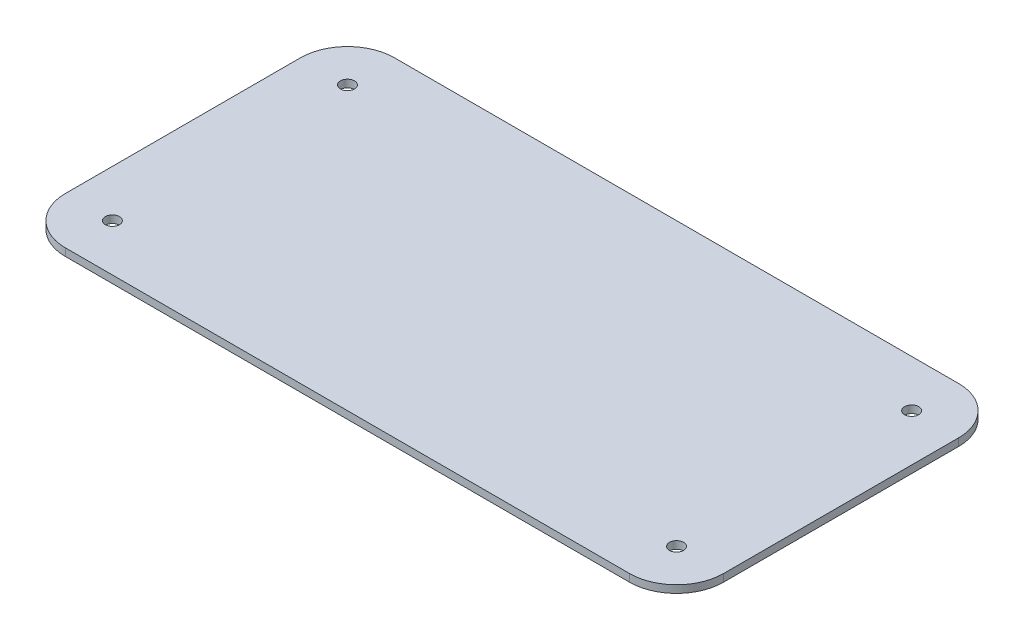
ISO-10303-21;
HEADER;
FILE_DESCRIPTION(('STEP AP214'),'2;1');
FILE_NAME('part.step','',(''),(''),'','','');
FILE_SCHEMA(('AUTOMOTIVE_DESIGN { 1 0 10303 214 1 1 1 1 }'));
ENDSEC;
DATA;
#1=APPLICATION_CONTEXT('core data for automotive mechanical design processes');
#2=APPLICATION_PROTOCOL_DEFINITION('international standard','automotive_design',2000,#1);
#3=PRODUCT_CONTEXT('',#1,'mechanical');
#4=PRODUCT('Part','Part','',(#3));
#5=PRODUCT_RELATED_PRODUCT_CATEGORY('part','',(#4));
#6=PRODUCT_DEFINITION_FORMATION('','',#4);
#7=PRODUCT_DEFINITION_CONTEXT('part definition',#1,'design');
#8=PRODUCT_DEFINITION('design','',#6,#7);
#9=PRODUCT_DEFINITION_SHAPE('','',#8);
#10=(LENGTH_UNIT() NAMED_UNIT(*) SI_UNIT(.MILLI.,.METRE.));
#11=(NAMED_UNIT(*) PLANE_ANGLE_UNIT() SI_UNIT($,.RADIAN.));
#12=(NAMED_UNIT(*) SI_UNIT($,.STERADIAN.) SOLID_ANGLE_UNIT());
#13=UNCERTAINTY_MEASURE_WITH_UNIT(LENGTH_MEASURE(1.E-05),#10,'distance_accuracy_value','');
#14=(GEOMETRIC_REPRESENTATION_CONTEXT(3) GLOBAL_UNCERTAINTY_ASSIGNED_CONTEXT((#13)) GLOBAL_UNIT_ASSIGNED_CONTEXT((#10,
#11,#12)) REPRESENTATION_CONTEXT('',''));
#15=CARTESIAN_POINT('',(0.,0.,0.));
#16=DIRECTION('',(0.,0.,1.));
#17=DIRECTION('',(1.,0.,0.));
#18=AXIS2_PLACEMENT_3D('',#15,#16,#17);
#19=CARTESIAN_POINT('',(50.,8.,-50.));
#20=DIRECTION('',(0.,-1.,0.));
#21=DIRECTION('',(0.,0.,-1.));
#22=AXIS2_PLACEMENT_3D('',#19,#20,#21);
#23=CYLINDRICAL_SURFACE('',#22,50.);
#24=CARTESIAN_POINT('',(50.,0.,-50.));
#25=DIRECTION('',(0.,1.,0.));
#26=DIRECTION('',(0.,0.,1.));
#27=AXIS2_PLACEMENT_3D('',#24,#25,#26);
#28=CIRCLE('',#27,50.);
#29=CARTESIAN_POINT('',(0.,0.,-50.0000000000004));
#30=VERTEX_POINT('',#29);
#31=CARTESIAN_POINT('',(50.0000000000004,0.,0.));
#32=VERTEX_POINT('',#31);
#33=EDGE_CURVE('E101',#30,#32,#28,.T.);
#34=ORIENTED_EDGE('',*,*,#33,.T.);
#35=DIRECTION('',(0.,-1.,0.));
#36=VECTOR('',#35,1.);
#37=CARTESIAN_POINT('',(50.0000000000004,8.,0.));
#38=LINE('',#37,#36);
#39=CARTESIAN_POINT('',(50.0000000000004,8.,0.));
#40=VERTEX_POINT('',#39);
#41=EDGE_CURVE('E11',#40,#32,#38,.T.);
#42=ORIENTED_EDGE('',*,*,#41,.F.);
#43=CARTESIAN_POINT('',(50.,8.,-50.));
#44=DIRECTION('',(0.,1.,0.));
#45=DIRECTION('',(0.,0.,1.));
#46=AXIS2_PLACEMENT_3D('',#43,#44,#45);
#47=CIRCLE('',#46,50.);
#48=CARTESIAN_POINT('',(0.,8.,-50.0000000000004));
#49=VERTEX_POINT('',#48);
#50=EDGE_CURVE('E133',#49,#40,#47,.T.);
#51=ORIENTED_EDGE('',*,*,#50,.F.);
#52=DIRECTION('',(0.,-1.,0.));
#53=VECTOR('',#52,1.);
#54=CARTESIAN_POINT('',(0.,8.,-50.0000000000004));
#55=LINE('',#54,#53);
#56=EDGE_CURVE('E114',#49,#30,#55,.T.);
#57=ORIENTED_EDGE('',*,*,#56,.T.);
#58=EDGE_LOOP('',(#34,#42,#51,#57));
#59=FACE_BOUND('',#58,.T.);
#60=ADVANCED_FACE('F33',(#59),#23,.T.);
#61=CARTESIAN_POINT('',(50.0000000000004,8.,0.));
#62=DIRECTION('',(0.,0.,-1.));
#63=DIRECTION('',(-1.,0.,0.));
#64=AXIS2_PLACEMENT_3D('',#61,#62,#63);
#65=PLANE('',#64);
#66=DIRECTION('',(1.,0.,0.));
#67=VECTOR('',#66,1.);
#68=CARTESIAN_POINT('',(50.0000000000004,0.,0.));
#69=LINE('',#68,#67);
#70=CARTESIAN_POINT('',(650.,0.,0.));
#71=VERTEX_POINT('',#70);
#72=EDGE_CURVE('E97',#32,#71,#69,.T.);
#73=ORIENTED_EDGE('',*,*,#72,.T.);
#74=DIRECTION('',(0.,-1.,0.));
#75=VECTOR('',#74,1.);
#76=CARTESIAN_POINT('',(650.,8.,0.));
#77=LINE('',#76,#75);
#78=CARTESIAN_POINT('',(650.,8.,0.));
#79=VERTEX_POINT('',#78);
#80=EDGE_CURVE('E40',#79,#71,#77,.T.);
#81=ORIENTED_EDGE('',*,*,#80,.F.);
#82=DIRECTION('',(1.,0.,0.));
#83=VECTOR('',#82,1.);
#84=CARTESIAN_POINT('',(50.0000000000004,8.,0.));
#85=LINE('',#84,#83);
#86=EDGE_CURVE('E110',#40,#79,#85,.T.);
#87=ORIENTED_EDGE('',*,*,#86,.F.);
#88=ORIENTED_EDGE('',*,*,#41,.T.);
#89=EDGE_LOOP('',(#73,#81,#87,#88));
#90=FACE_BOUND('',#89,.T.);
#91=ADVANCED_FACE('F109',(#90),#65,.F.);
#92=CARTESIAN_POINT('',(650.,8.,-50.));
#93=DIRECTION('',(0.,-1.,0.));
#94=DIRECTION('',(0.,0.,-1.));
#95=AXIS2_PLACEMENT_3D('',#92,#93,#94);
#96=CYLINDRICAL_SURFACE('',#95,50.);
#97=CARTESIAN_POINT('',(650.,0.,-50.));
#98=DIRECTION('',(0.,1.,0.));
#99=DIRECTION('',(0.,0.,1.));
#100=AXIS2_PLACEMENT_3D('',#97,#98,#99);
#101=CIRCLE('',#100,50.);
#102=CARTESIAN_POINT('',(700.,0.,-50.0000000000004));
#103=VERTEX_POINT('',#102);
#104=EDGE_CURVE('E103',#71,#103,#101,.T.);
#105=ORIENTED_EDGE('',*,*,#104,.T.);
#106=DIRECTION('',(0.,-1.,0.));
#107=VECTOR('',#106,1.);
#108=CARTESIAN_POINT('',(700.,8.,-50.0000000000004));
#109=LINE('',#108,#107);
#110=CARTESIAN_POINT('',(700.,8.,-50.0000000000004));
#111=VERTEX_POINT('',#110);
#112=EDGE_CURVE('E159',#111,#103,#109,.T.);
#113=ORIENTED_EDGE('',*,*,#112,.F.);
#114=CARTESIAN_POINT('',(650.,8.,-50.));
#115=DIRECTION('',(0.,1.,0.));
#116=DIRECTION('',(0.,0.,1.));
#117=AXIS2_PLACEMENT_3D('',#114,#115,#116);
#118=CIRCLE('',#117,50.);
#119=EDGE_CURVE('E136',#79,#111,#118,.T.);
#120=ORIENTED_EDGE('',*,*,#119,.F.);
#121=ORIENTED_EDGE('',*,*,#80,.T.);
#122=EDGE_LOOP('',(#105,#113,#120,#121));
#123=FACE_BOUND('',#122,.T.);
#124=ADVANCED_FACE('F163',(#123),#96,.T.);
#125=CARTESIAN_POINT('',(700.,8.,-50.0000000000004));
#126=DIRECTION('',(-1.,0.,0.));
#127=DIRECTION('',(0.,0.,1.));
#128=AXIS2_PLACEMENT_3D('',#125,#126,#127);
#129=PLANE('',#128);
#130=DIRECTION('',(0.,0.,-1.));
#131=VECTOR('',#130,1.);
#132=CARTESIAN_POINT('',(700.,0.,-50.0000000000004));
#133=LINE('',#132,#131);
#134=CARTESIAN_POINT('',(700.,0.,-300.));
#135=VERTEX_POINT('',#134);
#136=EDGE_CURVE('E123',#103,#135,#133,.T.);
#137=ORIENTED_EDGE('',*,*,#136,.T.);
#138=DIRECTION('',(0.,-1.,0.));
#139=VECTOR('',#138,1.);
#140=CARTESIAN_POINT('',(700.,8.,-300.));
#141=LINE('',#140,#139);
#142=CARTESIAN_POINT('',(700.,8.,-300.));
#143=VERTEX_POINT('',#142);
#144=EDGE_CURVE('E156',#143,#135,#141,.T.);
#145=ORIENTED_EDGE('',*,*,#144,.F.);
#146=DIRECTION('',(0.,0.,-1.));
#147=VECTOR('',#146,1.);
#148=CARTESIAN_POINT('',(700.,8.,-50.0000000000004));
#149=LINE('',#148,#147);
#150=EDGE_CURVE('E138',#111,#143,#149,.T.);
#151=ORIENTED_EDGE('',*,*,#150,.F.);
#152=ORIENTED_EDGE('',*,*,#112,.T.);
#153=EDGE_LOOP('',(#137,#145,#151,#152));
#154=FACE_BOUND('',#153,.T.);
#155=ADVANCED_FACE('F171',(#154),#129,.F.);
#156=CARTESIAN_POINT('',(650.,8.,-300.));
#157=DIRECTION('',(0.,-1.,0.));
#158=DIRECTION('',(0.,0.,-1.));
#159=AXIS2_PLACEMENT_3D('',#156,#157,#158);
#160=CYLINDRICAL_SURFACE('',#159,50.);
#161=CARTESIAN_POINT('',(650.,0.,-300.));
#162=DIRECTION('',(0.,1.,0.));
#163=DIRECTION('',(0.,0.,1.));
#164=AXIS2_PLACEMENT_3D('',#161,#162,#163);
#165=CIRCLE('',#164,50.);
#166=CARTESIAN_POINT('',(650.,0.,-350.));
#167=VERTEX_POINT('',#166);
#168=EDGE_CURVE('E125',#135,#167,#165,.T.);
#169=ORIENTED_EDGE('',*,*,#168,.T.);
#170=DIRECTION('',(0.,-1.,0.));
#171=VECTOR('',#170,1.);
#172=CARTESIAN_POINT('',(650.,8.,-350.));
#173=LINE('',#172,#171);
#174=CARTESIAN_POINT('',(650.,8.,-350.));
#175=VERTEX_POINT('',#174);
#176=EDGE_CURVE('E153',#175,#167,#173,.T.);
#177=ORIENTED_EDGE('',*,*,#176,.F.);
#178=CARTESIAN_POINT('',(650.,8.,-300.));
#179=DIRECTION('',(0.,1.,0.));
#180=DIRECTION('',(0.,0.,1.));
#181=AXIS2_PLACEMENT_3D('',#178,#179,#180);
#182=CIRCLE('',#181,50.);
#183=EDGE_CURVE('E140',#143,#175,#182,.T.);
#184=ORIENTED_EDGE('',*,*,#183,.F.);
#185=ORIENTED_EDGE('',*,*,#144,.T.);
#186=EDGE_LOOP('',(#169,#177,#184,#185));
#187=FACE_BOUND('',#186,.T.);
#188=ADVANCED_FACE('F174',(#187),#160,.T.);
#189=CARTESIAN_POINT('',(50.0000000000004,8.,-350.));
#190=DIRECTION('',(0.,0.,1.));
#191=DIRECTION('',(1.,0.,0.));
#192=AXIS2_PLACEMENT_3D('',#189,#190,#191);
#193=PLANE('',#192);
#194=DIRECTION('',(-1.,0.,0.));
#195=VECTOR('',#194,1.);
#196=CARTESIAN_POINT('',(50.0000000000004,0.,-350.));
#197=LINE('',#196,#195);
#198=CARTESIAN_POINT('',(50.0000000000004,0.,-350.));
#199=VERTEX_POINT('',#198);
#200=EDGE_CURVE('E127',#167,#199,#197,.T.);
#201=ORIENTED_EDGE('',*,*,#200,.T.);
#202=DIRECTION('',(0.,-1.,0.));
#203=VECTOR('',#202,1.);
#204=CARTESIAN_POINT('',(50.0000000000004,8.,-350.));
#205=LINE('',#204,#203);
#206=CARTESIAN_POINT('',(50.0000000000004,8.,-350.));
#207=VERTEX_POINT('',#206);
#208=EDGE_CURVE('E150',#207,#199,#205,.T.);
#209=ORIENTED_EDGE('',*,*,#208,.F.);
#210=DIRECTION('',(-1.,0.,0.));
#211=VECTOR('',#210,1.);
#212=CARTESIAN_POINT('',(50.0000000000004,8.,-350.));
#213=LINE('',#212,#211);
#214=EDGE_CURVE('E142',#175,#207,#213,.T.);
#215=ORIENTED_EDGE('',*,*,#214,.F.);
#216=ORIENTED_EDGE('',*,*,#176,.T.);
#217=EDGE_LOOP('',(#201,#209,#215,#216));
#218=FACE_BOUND('',#217,.T.);
#219=ADVANCED_FACE('F179',(#218),#193,.F.);
#220=CARTESIAN_POINT('',(50.,8.,-300.));
#221=DIRECTION('',(0.,-1.,0.));
#222=DIRECTION('',(0.,0.,-1.));
#223=AXIS2_PLACEMENT_3D('',#220,#221,#222);
#224=CYLINDRICAL_SURFACE('',#223,50.);
#225=CARTESIAN_POINT('',(50.,0.,-300.));
#226=DIRECTION('',(0.,1.,0.));
#227=DIRECTION('',(0.,0.,1.));
#228=AXIS2_PLACEMENT_3D('',#225,#226,#227);
#229=CIRCLE('',#228,50.);
#230=CARTESIAN_POINT('',(0.,0.,-300.));
#231=VERTEX_POINT('',#230);
#232=EDGE_CURVE('E129',#199,#231,#229,.T.);
#233=ORIENTED_EDGE('',*,*,#232,.T.);
#234=DIRECTION('',(0.,-1.,0.));
#235=VECTOR('',#234,1.);
#236=CARTESIAN_POINT('',(0.,8.,-300.));
#237=LINE('',#236,#235);
#238=CARTESIAN_POINT('',(0.,8.,-300.));
#239=VERTEX_POINT('',#238);
#240=EDGE_CURVE('E147',#239,#231,#237,.T.);
#241=ORIENTED_EDGE('',*,*,#240,.F.);
#242=CARTESIAN_POINT('',(50.,8.,-300.));
#243=DIRECTION('',(0.,1.,0.));
#244=DIRECTION('',(0.,0.,1.));
#245=AXIS2_PLACEMENT_3D('',#242,#243,#244);
#246=CIRCLE('',#245,50.);
#247=EDGE_CURVE('E52',#207,#239,#246,.T.);
#248=ORIENTED_EDGE('',*,*,#247,.F.);
#249=ORIENTED_EDGE('',*,*,#208,.T.);
#250=EDGE_LOOP('',(#233,#241,#248,#249));
#251=FACE_BOUND('',#250,.T.);
#252=ADVANCED_FACE('F182',(#251),#224,.T.);
#253=CARTESIAN_POINT('',(0.,8.,-50.0000000000004));
#254=DIRECTION('',(1.,0.,0.));
#255=DIRECTION('',(0.,0.,-1.));
#256=AXIS2_PLACEMENT_3D('',#253,#254,#255);
#257=PLANE('',#256);
#258=DIRECTION('',(0.,0.,1.));
#259=VECTOR('',#258,1.);
#260=CARTESIAN_POINT('',(0.,0.,-50.0000000000004));
#261=LINE('',#260,#259);
#262=EDGE_CURVE('E131',#231,#30,#261,.T.);
#263=ORIENTED_EDGE('',*,*,#262,.T.);
#264=ORIENTED_EDGE('',*,*,#56,.F.);
#265=DIRECTION('',(0.,0.,1.));
#266=VECTOR('',#265,1.);
#267=CARTESIAN_POINT('',(0.,8.,-50.0000000000004));
#268=LINE('',#267,#266);
#269=EDGE_CURVE('E47',#239,#49,#268,.T.);
#270=ORIENTED_EDGE('',*,*,#269,.F.);
#271=ORIENTED_EDGE('',*,*,#240,.T.);
#272=EDGE_LOOP('',(#263,#264,#270,#271));
#273=FACE_BOUND('',#272,.T.);
#274=ADVANCED_FACE('F184',(#273),#257,.F.);
#275=CARTESIAN_POINT('',(50.,8.,-50.));
#276=DIRECTION('',(0.,1.,0.));
#277=DIRECTION('',(0.,0.,1.));
#278=AXIS2_PLACEMENT_3D('',#275,#276,#277);
#279=PLANE('',#278);
#280=CARTESIAN_POINT('',(650.,8.,-300.));
#281=DIRECTION('',(0.,1.,0.));
#282=DIRECTION('',(0.,0.,1.));
#283=AXIS2_PLACEMENT_3D('',#280,#281,#282);
#284=CIRCLE('',#283,7.50000000000007);
#285=CARTESIAN_POINT('',(650.,8.,-292.5));
#286=VERTEX_POINT('',#285);
#287=EDGE_CURVE('E285',#286,#286,#284,.T.);
#288=ORIENTED_EDGE('',*,*,#287,.F.);
#289=EDGE_LOOP('',(#288));
#290=FACE_BOUND('',#289,.T.);
#291=CARTESIAN_POINT('',(650.,8.,-50.));
#292=DIRECTION('',(0.,1.,0.));
#293=DIRECTION('',(0.,0.,1.));
#294=AXIS2_PLACEMENT_3D('',#291,#292,#293);
#295=CIRCLE('',#294,7.50000000000007);
#296=CARTESIAN_POINT('',(650.,8.,-42.4999999999999));
#297=VERTEX_POINT('',#296);
#298=EDGE_CURVE('E287',#297,#297,#295,.T.);
#299=ORIENTED_EDGE('',*,*,#298,.F.);
#300=EDGE_LOOP('',(#299));
#301=FACE_BOUND('',#300,.T.);
#302=CARTESIAN_POINT('',(50.,8.,-300.));
#303=DIRECTION('',(0.,1.,0.));
#304=DIRECTION('',(0.,0.,1.));
#305=AXIS2_PLACEMENT_3D('',#302,#303,#304);
#306=CIRCLE('',#305,7.50000000000001);
#307=CARTESIAN_POINT('',(50.,8.,-292.5));
#308=VERTEX_POINT('',#307);
#309=EDGE_CURVE('E295',#308,#308,#306,.T.);
#310=ORIENTED_EDGE('',*,*,#309,.F.);
#311=EDGE_LOOP('',(#310));
#312=FACE_BOUND('',#311,.T.);
#313=CARTESIAN_POINT('',(50.,8.,-50.));
#314=DIRECTION('',(0.,1.,0.));
#315=DIRECTION('',(0.,0.,1.));
#316=AXIS2_PLACEMENT_3D('',#313,#314,#315);
#317=CIRCLE('',#316,7.50000000000001);
#318=CARTESIAN_POINT('',(50.,8.,-42.5));
#319=VERTEX_POINT('',#318);
#320=EDGE_CURVE('E118',#319,#319,#317,.T.);
#321=ORIENTED_EDGE('',*,*,#320,.F.);
#322=EDGE_LOOP('',(#321));
#323=FACE_BOUND('',#322,.T.);
#324=ORIENTED_EDGE('',*,*,#50,.T.);
#325=ORIENTED_EDGE('',*,*,#86,.T.);
#326=ORIENTED_EDGE('',*,*,#119,.T.);
#327=ORIENTED_EDGE('',*,*,#150,.T.);
#328=ORIENTED_EDGE('',*,*,#183,.T.);
#329=ORIENTED_EDGE('',*,*,#214,.T.);
#330=ORIENTED_EDGE('',*,*,#247,.T.);
#331=ORIENTED_EDGE('',*,*,#269,.T.);
#332=EDGE_LOOP('',(#324,#325,#326,#327,#328,#329,#330,#331));
#333=FACE_BOUND('',#332,.T.);
#334=ADVANCED_FACE('F166',(#290,#301,#312,#323,#333),#279,.T.);
#335=CARTESIAN_POINT('',(50.,0.,-50.));
#336=DIRECTION('',(0.,1.,0.));
#337=DIRECTION('',(0.,0.,1.));
#338=AXIS2_PLACEMENT_3D('',#335,#336,#337);
#339=PLANE('',#338);
#340=CARTESIAN_POINT('',(650.,0.,-300.));
#341=DIRECTION('',(0.,1.,0.));
#342=DIRECTION('',(0.,0.,1.));
#343=AXIS2_PLACEMENT_3D('',#340,#341,#342);
#344=CIRCLE('',#343,7.50000000000007);
#345=CARTESIAN_POINT('',(650.,0.,-292.5));
#346=VERTEX_POINT('',#345);
#347=EDGE_CURVE('E282',#346,#346,#344,.T.);
#348=ORIENTED_EDGE('',*,*,#347,.T.);
#349=EDGE_LOOP('',(#348));
#350=FACE_BOUND('',#349,.T.);
#351=CARTESIAN_POINT('',(650.,0.,-50.));
#352=DIRECTION('',(0.,1.,0.));
#353=DIRECTION('',(0.,0.,1.));
#354=AXIS2_PLACEMENT_3D('',#351,#352,#353);
#355=CIRCLE('',#354,7.50000000000007);
#356=CARTESIAN_POINT('',(650.,0.,-42.4999999999999));
#357=VERTEX_POINT('',#356);
#358=EDGE_CURVE('E292',#357,#357,#355,.T.);
#359=ORIENTED_EDGE('',*,*,#358,.T.);
#360=EDGE_LOOP('',(#359));
#361=FACE_BOUND('',#360,.T.);
#362=CARTESIAN_POINT('',(50.,0.,-300.));
#363=DIRECTION('',(0.,1.,0.));
#364=DIRECTION('',(0.,0.,1.));
#365=AXIS2_PLACEMENT_3D('',#362,#363,#364);
#366=CIRCLE('',#365,7.50000000000001);
#367=CARTESIAN_POINT('',(50.,0.,-292.5));
#368=VERTEX_POINT('',#367);
#369=EDGE_CURVE('E298',#368,#368,#366,.T.);
#370=ORIENTED_EDGE('',*,*,#369,.T.);
#371=EDGE_LOOP('',(#370));
#372=FACE_BOUND('',#371,.T.);
#373=CARTESIAN_POINT('',(50.,0.,-50.));
#374=DIRECTION('',(0.,1.,0.));
#375=DIRECTION('',(0.,0.,1.));
#376=AXIS2_PLACEMENT_3D('',#373,#374,#375);
#377=CIRCLE('',#376,7.50000000000001);
#378=CARTESIAN_POINT('',(50.,0.,-42.5));
#379=VERTEX_POINT('',#378);
#380=EDGE_CURVE('E115',#379,#379,#377,.T.);
#381=ORIENTED_EDGE('',*,*,#380,.T.);
#382=EDGE_LOOP('',(#381));
#383=FACE_BOUND('',#382,.T.);
#384=ORIENTED_EDGE('',*,*,#33,.F.);
#385=ORIENTED_EDGE('',*,*,#262,.F.);
#386=ORIENTED_EDGE('',*,*,#232,.F.);
#387=ORIENTED_EDGE('',*,*,#200,.F.);
#388=ORIENTED_EDGE('',*,*,#168,.F.);
#389=ORIENTED_EDGE('',*,*,#136,.F.);
#390=ORIENTED_EDGE('',*,*,#104,.F.);
#391=ORIENTED_EDGE('',*,*,#72,.F.);
#392=EDGE_LOOP('',(#384,#385,#386,#387,#388,#389,#390,#391));
#393=FACE_BOUND('',#392,.T.);
#394=ADVANCED_FACE('F98',(#350,#361,#372,#383,#393),#339,.F.);
#395=CARTESIAN_POINT('',(50.,0.,-50.));
#396=DIRECTION('',(0.,1.,0.));
#397=DIRECTION('',(0.,0.,1.));
#398=AXIS2_PLACEMENT_3D('',#395,#396,#397);
#399=CYLINDRICAL_SURFACE('',#398,7.50000000000001);
#400=ORIENTED_EDGE('',*,*,#380,.F.);
#401=EDGE_LOOP('',(#400));
#402=FACE_BOUND('',#401,.T.);
#403=ORIENTED_EDGE('',*,*,#320,.T.);
#404=EDGE_LOOP('',(#403));
#405=FACE_BOUND('',#404,.T.);
#406=ADVANCED_FACE('F235',(#402,#405),#399,.F.);
#407=CARTESIAN_POINT('',(50.,0.,-300.));
#408=DIRECTION('',(0.,1.,0.));
#409=DIRECTION('',(0.,0.,1.));
#410=AXIS2_PLACEMENT_3D('',#407,#408,#409);
#411=CYLINDRICAL_SURFACE('',#410,7.50000000000001);
#412=ORIENTED_EDGE('',*,*,#369,.F.);
#413=EDGE_LOOP('',(#412));
#414=FACE_BOUND('',#413,.T.);
#415=ORIENTED_EDGE('',*,*,#309,.T.);
#416=EDGE_LOOP('',(#415));
#417=FACE_BOUND('',#416,.T.);
#418=ADVANCED_FACE('F245',(#414,#417),#411,.F.);
#419=CARTESIAN_POINT('',(650.,0.,-50.));
#420=DIRECTION('',(0.,1.,0.));
#421=DIRECTION('',(0.,0.,1.));
#422=AXIS2_PLACEMENT_3D('',#419,#420,#421);
#423=CYLINDRICAL_SURFACE('',#422,7.50000000000007);
#424=ORIENTED_EDGE('',*,*,#358,.F.);
#425=EDGE_LOOP('',(#424));
#426=FACE_BOUND('',#425,.T.);
#427=ORIENTED_EDGE('',*,*,#298,.T.);
#428=EDGE_LOOP('',(#427));
#429=FACE_BOUND('',#428,.T.);
#430=ADVANCED_FACE('F255',(#426,#429),#423,.F.);
#431=CARTESIAN_POINT('',(650.,0.,-300.));
#432=DIRECTION('',(0.,1.,0.));
#433=DIRECTION('',(0.,0.,1.));
#434=AXIS2_PLACEMENT_3D('',#431,#432,#433);
#435=CYLINDRICAL_SURFACE('',#434,7.50000000000007);
#436=ORIENTED_EDGE('',*,*,#347,.F.);
#437=EDGE_LOOP('',(#436));
#438=FACE_BOUND('',#437,.T.);
#439=ORIENTED_EDGE('',*,*,#287,.T.);
#440=EDGE_LOOP('',(#439));
#441=FACE_BOUND('',#440,.T.);
#442=ADVANCED_FACE('F265',(#438,#441),#435,.F.);
#443=CLOSED_SHELL('',(#60,#91,#124,#155,#188,#219,#252,#274,#334,#394,#406,#418,#430,#442));
#444=MANIFOLD_SOLID_BREP('B2',#443);
#445=ADVANCED_BREP_SHAPE_REPRESENTATION('',(#18,#444),#14);
#446=SHAPE_DEFINITION_REPRESENTATION(#9,#445);
ENDSEC;
END-ISO-10303-21;
